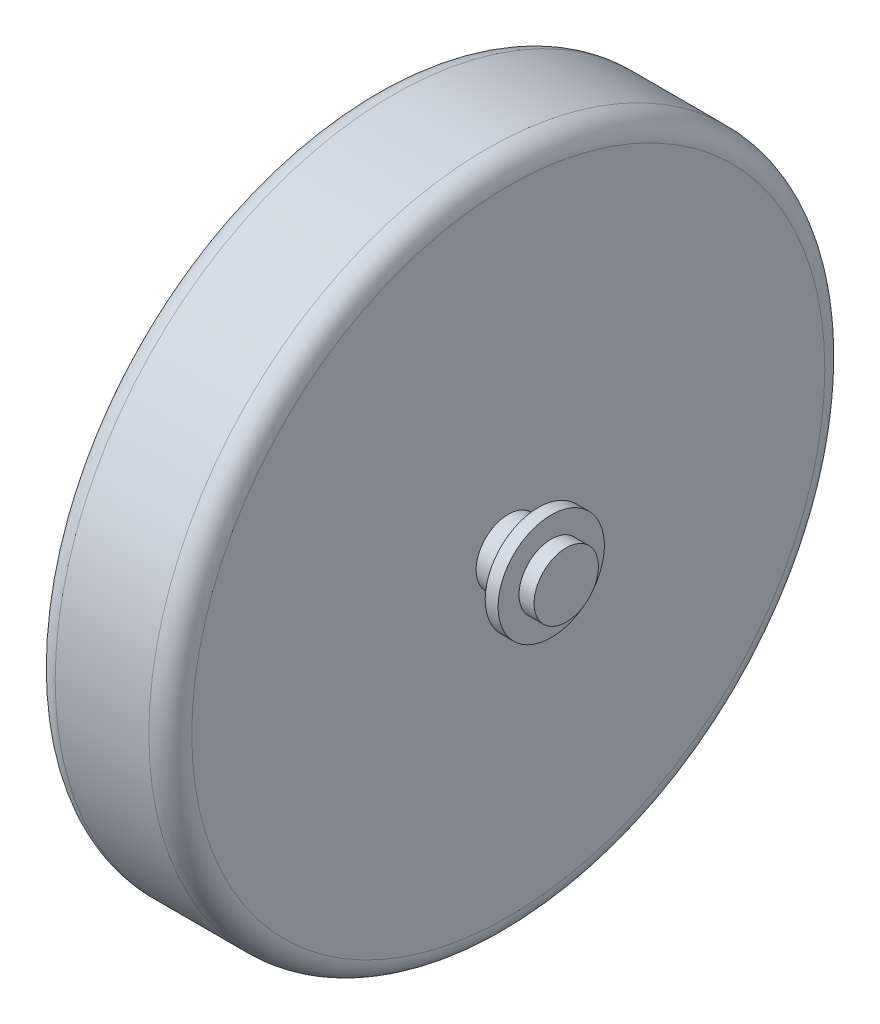
ISO-10303-21;
HEADER;
FILE_DESCRIPTION(('STEP AP214'),'2;1');
FILE_NAME('part.step','',(''),(''),'','','');
FILE_SCHEMA(('AUTOMOTIVE_DESIGN { 1 0 10303 214 1 1 1 1 }'));
ENDSEC;
DATA;
#1=APPLICATION_CONTEXT('core data for automotive mechanical design processes');
#2=APPLICATION_PROTOCOL_DEFINITION('international standard','automotive_design',2000,#1);
#3=PRODUCT_CONTEXT('',#1,'mechanical');
#4=PRODUCT('Part','Part','',(#3));
#5=PRODUCT_RELATED_PRODUCT_CATEGORY('part','',(#4));
#6=PRODUCT_DEFINITION_FORMATION('','',#4);
#7=PRODUCT_DEFINITION_CONTEXT('part definition',#1,'design');
#8=PRODUCT_DEFINITION('design','',#6,#7);
#9=PRODUCT_DEFINITION_SHAPE('','',#8);
#10=(LENGTH_UNIT() NAMED_UNIT(*) SI_UNIT(.MILLI.,.METRE.));
#11=(NAMED_UNIT(*) PLANE_ANGLE_UNIT() SI_UNIT($,.RADIAN.));
#12=(NAMED_UNIT(*) SI_UNIT($,.STERADIAN.) SOLID_ANGLE_UNIT());
#13=UNCERTAINTY_MEASURE_WITH_UNIT(LENGTH_MEASURE(1.E-05),#10,'distance_accuracy_value','');
#14=(GEOMETRIC_REPRESENTATION_CONTEXT(3) GLOBAL_UNCERTAINTY_ASSIGNED_CONTEXT((#13)) GLOBAL_UNIT_ASSIGNED_CONTEXT((#10,
#11,#12)) REPRESENTATION_CONTEXT('',''));
#15=CARTESIAN_POINT('',(0.,0.,0.));
#16=DIRECTION('',(0.,0.,1.));
#17=DIRECTION('',(1.,0.,0.));
#18=AXIS2_PLACEMENT_3D('',#15,#16,#17);
#19=CARTESIAN_POINT('',(-119.,0.,0.));
#20=DIRECTION('',(-1.,0.,0.));
#21=DIRECTION('',(0.,0.,1.));
#22=AXIS2_PLACEMENT_3D('',#19,#20,#21);
#23=CYLINDRICAL_SURFACE('',#22,63.5);
#24=CARTESIAN_POINT('',(-97.,0.,0.));
#25=DIRECTION('',(-1.,0.,0.));
#26=DIRECTION('',(0.,0.,1.));
#27=AXIS2_PLACEMENT_3D('',#24,#25,#26);
#28=CIRCLE('',#27,63.5);
#29=CARTESIAN_POINT('',(-97.,0.,63.5));
#30=VERTEX_POINT('',#29);
#31=EDGE_CURVE('E56',#30,#30,#28,.T.);
#32=ORIENTED_EDGE('',*,*,#31,.F.);
#33=EDGE_LOOP('',(#32));
#34=FACE_BOUND('',#33,.T.);
#35=CARTESIAN_POINT('',(-90.65,0.,0.));
#36=DIRECTION('',(-1.,0.,0.));
#37=DIRECTION('',(0.,0.,1.));
#38=AXIS2_PLACEMENT_3D('',#35,#36,#37);
#39=CIRCLE('',#38,63.5);
#40=CARTESIAN_POINT('',(-90.65,0.,63.5));
#41=VERTEX_POINT('',#40);
#42=EDGE_CURVE('E88',#41,#41,#39,.T.);
#43=ORIENTED_EDGE('',*,*,#42,.T.);
#44=EDGE_LOOP('',(#43));
#45=FACE_BOUND('',#44,.T.);
#46=ADVANCED_FACE('F39',(#34,#45),#23,.T.);
#47=CARTESIAN_POINT('',(-97.,0.,-63.5));
#48=DIRECTION('',(1.,0.,0.));
#49=DIRECTION('',(0.,0.,-1.));
#50=AXIS2_PLACEMENT_3D('',#47,#48,#49);
#51=PLANE('',#50);
#52=CARTESIAN_POINT('',(-97.,58.,0.));
#53=DIRECTION('',(-1.,0.,0.));
#54=DIRECTION('',(0.,0.,1.));
#55=AXIS2_PLACEMENT_3D('',#52,#53,#54);
#56=CIRCLE('',#55,3.175);
#57=CARTESIAN_POINT('',(-97.,58.,3.17500000000001));
#58=VERTEX_POINT('',#57);
#59=EDGE_CURVE('E113',#58,#58,#56,.T.);
#60=ORIENTED_EDGE('',*,*,#59,.F.);
#61=EDGE_LOOP('',(#60));
#62=FACE_BOUND('',#61,.T.);
#63=CARTESIAN_POINT('',(-97.,29.0000000000077,-50.229473419493));
#64=DIRECTION('',(-1.,0.,0.));
#65=DIRECTION('',(0.,0.,1.));
#66=AXIS2_PLACEMENT_3D('',#63,#64,#65);
#67=CIRCLE('',#66,3.17499999999217);
#68=CARTESIAN_POINT('',(-97.,29.0000000000077,-47.0544734195008));
#69=VERTEX_POINT('',#68);
#70=EDGE_CURVE('E94',#69,#69,#67,.T.);
#71=ORIENTED_EDGE('',*,*,#70,.F.);
#72=EDGE_LOOP('',(#71));
#73=FACE_BOUND('',#72,.T.);
#74=CARTESIAN_POINT('',(-97.,-28.9999999999939,-50.229473419501));
#75=DIRECTION('',(-1.,0.,0.));
#76=DIRECTION('',(0.,0.,1.));
#77=AXIS2_PLACEMENT_3D('',#74,#75,#76);
#78=CIRCLE('',#77,3.17499999999374);
#79=CARTESIAN_POINT('',(-97.,-28.9999999999939,-47.0544734195072));
#80=VERTEX_POINT('',#79);
#81=EDGE_CURVE('E91',#80,#80,#78,.T.);
#82=ORIENTED_EDGE('',*,*,#81,.F.);
#83=EDGE_LOOP('',(#82));
#84=FACE_BOUND('',#83,.T.);
#85=CARTESIAN_POINT('',(-97.,-58.,-5.28919774014336E-12));
#86=DIRECTION('',(-1.,0.,0.));
#87=DIRECTION('',(0.,0.,1.));
#88=AXIS2_PLACEMENT_3D('',#85,#86,#87);
#89=CIRCLE('',#88,3.17499999999532);
#90=CARTESIAN_POINT('',(-97.,-58.,3.17499999999003));
#91=VERTEX_POINT('',#90);
#92=EDGE_CURVE('E99',#91,#91,#89,.T.);
#93=ORIENTED_EDGE('',*,*,#92,.F.);
#94=EDGE_LOOP('',(#93));
#95=FACE_BOUND('',#94,.T.);
#96=CARTESIAN_POINT('',(-97.,-29.0000000000031,50.2294734194957));
#97=DIRECTION('',(-1.,0.,0.));
#98=DIRECTION('',(0.,0.,1.));
#99=AXIS2_PLACEMENT_3D('',#96,#97,#98);
#100=CIRCLE('',#99,3.17499999999688);
#101=CARTESIAN_POINT('',(-97.,-29.0000000000031,53.4044734194926));
#102=VERTEX_POINT('',#101);
#103=EDGE_CURVE('E106',#102,#102,#100,.T.);
#104=ORIENTED_EDGE('',*,*,#103,.F.);
#105=EDGE_LOOP('',(#104));
#106=FACE_BOUND('',#105,.T.);
#107=CARTESIAN_POINT('',(-97.,28.9999999999985,50.2294734194983));
#108=DIRECTION('',(-1.,0.,0.));
#109=DIRECTION('',(0.,0.,1.));
#110=AXIS2_PLACEMENT_3D('',#107,#108,#109);
#111=CIRCLE('',#110,3.17499999999843);
#112=CARTESIAN_POINT('',(-97.,28.9999999999985,53.4044734194968));
#113=VERTEX_POINT('',#112);
#114=EDGE_CURVE('E115',#113,#113,#111,.T.);
#115=ORIENTED_EDGE('',*,*,#114,.F.);
#116=EDGE_LOOP('',(#115));
#117=FACE_BOUND('',#116,.T.);
#118=CARTESIAN_POINT('',(-97.,0.,0.));
#119=DIRECTION('',(-1.,0.,0.));
#120=DIRECTION('',(0.,0.,1.));
#121=AXIS2_PLACEMENT_3D('',#118,#119,#120);
#122=CIRCLE('',#121,47.);
#123=CARTESIAN_POINT('',(-97.,0.,47.));
#124=VERTEX_POINT('',#123);
#125=EDGE_CURVE('E65',#124,#124,#122,.T.);
#126=ORIENTED_EDGE('',*,*,#125,.F.);
#127=EDGE_LOOP('',(#126));
#128=FACE_BOUND('',#127,.T.);
#129=ORIENTED_EDGE('',*,*,#31,.T.);
#130=EDGE_LOOP('',(#129));
#131=FACE_BOUND('',#130,.T.);
#132=ADVANCED_FACE('F134',(#62,#73,#84,#95,#106,#117,#128,#131),#51,.F.);
#133=CARTESIAN_POINT('',(-119.,0.,0.));
#134=DIRECTION('',(-1.,0.,0.));
#135=DIRECTION('',(0.,0.,1.));
#136=AXIS2_PLACEMENT_3D('',#133,#134,#135);
#137=CYLINDRICAL_SURFACE('',#136,47.);
#138=CARTESIAN_POINT('',(-119.,0.,0.));
#139=DIRECTION('',(-1.,0.,0.));
#140=DIRECTION('',(0.,0.,1.));
#141=AXIS2_PLACEMENT_3D('',#138,#139,#140);
#142=CIRCLE('',#141,47.);
#143=CARTESIAN_POINT('',(-119.,0.,47.));
#144=VERTEX_POINT('',#143);
#145=EDGE_CURVE('E64',#144,#144,#142,.T.);
#146=ORIENTED_EDGE('',*,*,#145,.F.);
#147=EDGE_LOOP('',(#146));
#148=FACE_BOUND('',#147,.T.);
#149=ORIENTED_EDGE('',*,*,#125,.T.);
#150=EDGE_LOOP('',(#149));
#151=FACE_BOUND('',#150,.T.);
#152=ADVANCED_FACE('F139',(#148,#151),#137,.T.);
#153=CARTESIAN_POINT('',(-119.,0.,-47.));
#154=DIRECTION('',(1.,0.,0.));
#155=DIRECTION('',(0.,0.,-1.));
#156=AXIS2_PLACEMENT_3D('',#153,#154,#155);
#157=PLANE('',#156);
#158=ORIENTED_EDGE('',*,*,#145,.T.);
#159=EDGE_LOOP('',(#158));
#160=FACE_BOUND('',#159,.T.);
#161=ADVANCED_FACE('F203',(#160),#157,.F.);
#162=CARTESIAN_POINT('',(0.,0.,-15.));
#163=DIRECTION('',(-1.,0.,0.));
#164=DIRECTION('',(0.,0.,1.));
#165=AXIS2_PLACEMENT_3D('',#162,#163,#164);
#166=PLANE('',#165);
#167=CARTESIAN_POINT('',(0.,0.,0.));
#168=DIRECTION('',(-1.,0.,0.));
#169=DIRECTION('',(0.,0.,1.));
#170=AXIS2_PLACEMENT_3D('',#167,#168,#169);
#171=CIRCLE('',#170,15.);
#172=CARTESIAN_POINT('',(0.,0.,15.));
#173=VERTEX_POINT('',#172);
#174=EDGE_CURVE('E69',#173,#173,#171,.T.);
#175=ORIENTED_EDGE('',*,*,#174,.F.);
#176=EDGE_LOOP('',(#175));
#177=FACE_BOUND('',#176,.T.);
#178=ADVANCED_FACE('F197',(#177),#166,.F.);
#179=CARTESIAN_POINT('',(-119.,0.,0.));
#180=DIRECTION('',(-1.,0.,0.));
#181=DIRECTION('',(0.,0.,1.));
#182=AXIS2_PLACEMENT_3D('',#179,#180,#181);
#183=CYLINDRICAL_SURFACE('',#182,15.);
#184=CARTESIAN_POINT('',(-7.00000000000001,0.,0.));
#185=DIRECTION('',(-1.,0.,0.));
#186=DIRECTION('',(0.,0.,1.));
#187=AXIS2_PLACEMENT_3D('',#184,#185,#186);
#188=CIRCLE('',#187,15.);
#189=CARTESIAN_POINT('',(-7.,0.,15.));
#190=VERTEX_POINT('',#189);
#191=EDGE_CURVE('E72',#190,#190,#188,.T.);
#192=ORIENTED_EDGE('',*,*,#191,.F.);
#193=EDGE_LOOP('',(#192));
#194=FACE_BOUND('',#193,.T.);
#195=ORIENTED_EDGE('',*,*,#174,.T.);
#196=EDGE_LOOP('',(#195));
#197=FACE_BOUND('',#196,.T.);
#198=ADVANCED_FACE('F194',(#194,#197),#183,.T.);
#199=CARTESIAN_POINT('',(-7.,0.,-24.7657490065609));
#200=DIRECTION('',(-1.,0.,0.));
#201=DIRECTION('',(0.,0.,1.));
#202=AXIS2_PLACEMENT_3D('',#199,#200,#201);
#203=PLANE('',#202);
#204=CARTESIAN_POINT('',(-7.00000000000001,0.,0.));
#205=DIRECTION('',(-1.,0.,0.));
#206=DIRECTION('',(0.,0.,1.));
#207=AXIS2_PLACEMENT_3D('',#204,#205,#206);
#208=CIRCLE('',#207,24.7657490065609);
#209=CARTESIAN_POINT('',(-7.,0.,24.7657490065609));
#210=VERTEX_POINT('',#209);
#211=EDGE_CURVE('E74',#210,#210,#208,.T.);
#212=ORIENTED_EDGE('',*,*,#211,.F.);
#213=EDGE_LOOP('',(#212));
#214=FACE_BOUND('',#213,.T.);
#215=ORIENTED_EDGE('',*,*,#191,.T.);
#216=EDGE_LOOP('',(#215));
#217=FACE_BOUND('',#216,.T.);
#218=ADVANCED_FACE('F188',(#214,#217),#203,.F.);
#219=CARTESIAN_POINT('',(-119.,0.,0.));
#220=DIRECTION('',(-1.,0.,0.));
#221=DIRECTION('',(0.,0.,1.));
#222=AXIS2_PLACEMENT_3D('',#219,#220,#221);
#223=CYLINDRICAL_SURFACE('',#222,24.7657490065609);
#224=CARTESIAN_POINT('',(-13.,0.,0.));
#225=DIRECTION('',(-1.,0.,0.));
#226=DIRECTION('',(0.,0.,1.));
#227=AXIS2_PLACEMENT_3D('',#224,#225,#226);
#228=CIRCLE('',#227,24.7657490065609);
#229=CARTESIAN_POINT('',(-13.,0.,24.7657490065609));
#230=VERTEX_POINT('',#229);
#231=EDGE_CURVE('E80',#230,#230,#228,.T.);
#232=ORIENTED_EDGE('',*,*,#231,.F.);
#233=EDGE_LOOP('',(#232));
#234=FACE_BOUND('',#233,.T.);
#235=ORIENTED_EDGE('',*,*,#211,.T.);
#236=EDGE_LOOP('',(#235));
#237=FACE_BOUND('',#236,.T.);
#238=ADVANCED_FACE('F183',(#234,#237),#223,.T.);
#239=CARTESIAN_POINT('',(-13.,0.,-15.));
#240=DIRECTION('',(1.,0.,0.));
#241=DIRECTION('',(0.,0.,-1.));
#242=AXIS2_PLACEMENT_3D('',#239,#240,#241);
#243=PLANE('',#242);
#244=CARTESIAN_POINT('',(-13.,0.,0.));
#245=DIRECTION('',(-1.,0.,0.));
#246=DIRECTION('',(0.,0.,1.));
#247=AXIS2_PLACEMENT_3D('',#244,#245,#246);
#248=CIRCLE('',#247,15.);
#249=CARTESIAN_POINT('',(-13.,0.,15.));
#250=VERTEX_POINT('',#249);
#251=EDGE_CURVE('E79',#250,#250,#248,.T.);
#252=ORIENTED_EDGE('',*,*,#251,.F.);
#253=EDGE_LOOP('',(#252));
#254=FACE_BOUND('',#253,.T.);
#255=ORIENTED_EDGE('',*,*,#231,.T.);
#256=EDGE_LOOP('',(#255));
#257=FACE_BOUND('',#256,.T.);
#258=ADVANCED_FACE('F182',(#254,#257),#243,.F.);
#259=CARTESIAN_POINT('',(-119.,0.,0.));
#260=DIRECTION('',(-1.,0.,0.));
#261=DIRECTION('',(0.,0.,1.));
#262=AXIS2_PLACEMENT_3D('',#259,#260,#261);
#263=CYLINDRICAL_SURFACE('',#262,15.);
#264=CARTESIAN_POINT('',(-27.,0.,0.));
#265=DIRECTION('',(-1.,0.,0.));
#266=DIRECTION('',(0.,0.,1.));
#267=AXIS2_PLACEMENT_3D('',#264,#265,#266);
#268=CIRCLE('',#267,15.);
#269=CARTESIAN_POINT('',(-27.,0.,15.));
#270=VERTEX_POINT('',#269);
#271=EDGE_CURVE('E84',#270,#270,#268,.T.);
#272=ORIENTED_EDGE('',*,*,#271,.F.);
#273=EDGE_LOOP('',(#272));
#274=FACE_BOUND('',#273,.T.);
#275=ORIENTED_EDGE('',*,*,#251,.T.);
#276=EDGE_LOOP('',(#275));
#277=FACE_BOUND('',#276,.T.);
#278=ADVANCED_FACE('F179',(#274,#277),#263,.T.);
#279=CARTESIAN_POINT('',(-27.,0.,-157.5));
#280=DIRECTION('',(-1.,0.,0.));
#281=DIRECTION('',(0.,0.,1.));
#282=AXIS2_PLACEMENT_3D('',#279,#280,#281);
#283=PLANE('',#282);
#284=CARTESIAN_POINT('',(-27.,0.,0.));
#285=DIRECTION('',(-1.,0.,0.));
#286=DIRECTION('',(0.,0.,1.));
#287=AXIS2_PLACEMENT_3D('',#284,#285,#286);
#288=CIRCLE('',#287,147.5);
#289=CARTESIAN_POINT('',(-27.,0.,147.5));
#290=VERTEX_POINT('',#289);
#291=EDGE_CURVE('E46',#290,#290,#288,.F.);
#292=ORIENTED_EDGE('',*,*,#291,.T.);
#293=EDGE_LOOP('',(#292));
#294=FACE_BOUND('',#293,.T.);
#295=ORIENTED_EDGE('',*,*,#271,.T.);
#296=EDGE_LOOP('',(#295));
#297=FACE_BOUND('',#296,.T.);
#298=ADVANCED_FACE('F166',(#294,#297),#283,.F.);
#299=CARTESIAN_POINT('',(-119.,0.,0.));
#300=DIRECTION('',(-1.,0.,0.));
#301=DIRECTION('',(0.,0.,1.));
#302=AXIS2_PLACEMENT_3D('',#299,#300,#301);
#303=CYLINDRICAL_SURFACE('',#302,157.5);
#304=CARTESIAN_POINT('',(-37.,0.,0.));
#305=DIRECTION('',(-1.,0.,0.));
#306=DIRECTION('',(0.,0.,1.));
#307=AXIS2_PLACEMENT_3D('',#304,#305,#306);
#308=CIRCLE('',#307,157.5);
#309=CARTESIAN_POINT('',(-37.,0.,157.5));
#310=VERTEX_POINT('',#309);
#311=EDGE_CURVE('E49',#310,#310,#308,.T.);
#312=ORIENTED_EDGE('',*,*,#311,.T.);
#313=EDGE_LOOP('',(#312));
#314=FACE_BOUND('',#313,.T.);
#315=CARTESIAN_POINT('',(-80.65,0.,0.));
#316=DIRECTION('',(1.,0.,0.));
#317=DIRECTION('',(0.,0.,-1.));
#318=AXIS2_PLACEMENT_3D('',#315,#316,#317);
#319=CIRCLE('',#318,157.5);
#320=CARTESIAN_POINT('',(-80.65,0.,-157.5));
#321=VERTEX_POINT('',#320);
#322=EDGE_CURVE('E53',#321,#321,#319,.T.);
#323=ORIENTED_EDGE('',*,*,#322,.T.);
#324=EDGE_LOOP('',(#323));
#325=FACE_BOUND('',#324,.T.);
#326=ADVANCED_FACE('F165',(#314,#325),#303,.T.);
#327=CARTESIAN_POINT('',(-90.65,0.,-63.5));
#328=DIRECTION('',(1.,0.,0.));
#329=DIRECTION('',(0.,0.,-1.));
#330=AXIS2_PLACEMENT_3D('',#327,#328,#329);
#331=PLANE('',#330);
#332=CARTESIAN_POINT('',(-90.65,0.,0.));
#333=DIRECTION('',(1.,0.,0.));
#334=DIRECTION('',(0.,0.,-1.));
#335=AXIS2_PLACEMENT_3D('',#332,#333,#334);
#336=CIRCLE('',#335,147.5);
#337=CARTESIAN_POINT('',(-90.65,0.,-147.5));
#338=VERTEX_POINT('',#337);
#339=EDGE_CURVE('E10',#338,#338,#336,.F.);
#340=ORIENTED_EDGE('',*,*,#339,.T.);
#341=EDGE_LOOP('',(#340));
#342=FACE_BOUND('',#341,.T.);
#343=ORIENTED_EDGE('',*,*,#42,.F.);
#344=EDGE_LOOP('',(#343));
#345=FACE_BOUND('',#344,.T.);
#346=ADVANCED_FACE('F157',(#342,#345),#331,.F.);
#347=CARTESIAN_POINT('',(-37.,0.,0.));
#348=DIRECTION('',(-1.,0.,0.));
#349=DIRECTION('',(0.,0.,1.));
#350=AXIS2_PLACEMENT_3D('',#347,#348,#349);
#351=TOROIDAL_SURFACE('',#350,147.5,10.);
#352=ORIENTED_EDGE('',*,*,#291,.F.);
#353=EDGE_LOOP('',(#352));
#354=FACE_BOUND('',#353,.T.);
#355=ORIENTED_EDGE('',*,*,#311,.F.);
#356=EDGE_LOOP('',(#355));
#357=FACE_BOUND('',#356,.T.);
#358=ADVANCED_FACE('F161',(#354,#357),#351,.T.);
#359=CARTESIAN_POINT('',(-80.65,0.,0.));
#360=DIRECTION('',(1.,0.,0.));
#361=DIRECTION('',(0.,0.,-1.));
#362=AXIS2_PLACEMENT_3D('',#359,#360,#361);
#363=TOROIDAL_SURFACE('',#362,147.5,10.);
#364=ORIENTED_EDGE('',*,*,#322,.F.);
#365=EDGE_LOOP('',(#364));
#366=FACE_BOUND('',#365,.T.);
#367=ORIENTED_EDGE('',*,*,#339,.F.);
#368=EDGE_LOOP('',(#367));
#369=FACE_BOUND('',#368,.T.);
#370=ADVANCED_FACE('F41',(#366,#369),#363,.T.);
#371=CARTESIAN_POINT('',(-87.,28.9999999999985,50.2294734194983));
#372=DIRECTION('',(-1.,0.,0.));
#373=DIRECTION('',(0.,0.,1.));
#374=AXIS2_PLACEMENT_3D('',#371,#372,#373);
#375=CYLINDRICAL_SURFACE('',#374,3.17499999999843);
#376=CARTESIAN_POINT('',(-87.,28.9999999999985,50.2294734194983));
#377=DIRECTION('',(-1.,0.,0.));
#378=DIRECTION('',(0.,0.,1.));
#379=AXIS2_PLACEMENT_3D('',#376,#377,#378);
#380=CIRCLE('',#379,3.17499999999843);
#381=CARTESIAN_POINT('',(-87.,28.9999999999985,53.4044734194968));
#382=VERTEX_POINT('',#381);
#383=EDGE_CURVE('E108',#382,#382,#380,.T.);
#384=ORIENTED_EDGE('',*,*,#383,.F.);
#385=EDGE_LOOP('',(#384));
#386=FACE_BOUND('',#385,.T.);
#387=ORIENTED_EDGE('',*,*,#114,.T.);
#388=EDGE_LOOP('',(#387));
#389=FACE_BOUND('',#388,.T.);
#390=ADVANCED_FACE('F278',(#386,#389),#375,.F.);
#391=CARTESIAN_POINT('',(-87.,28.9999999999985,50.2294734194983));
#392=DIRECTION('',(-1.,0.,0.));
#393=DIRECTION('',(0.,0.,1.));
#394=AXIS2_PLACEMENT_3D('',#391,#392,#393);
#395=PLANE('',#394);
#396=ORIENTED_EDGE('',*,*,#383,.T.);
#397=EDGE_LOOP('',(#396));
#398=FACE_BOUND('',#397,.T.);
#399=ADVANCED_FACE('F286',(#398),#395,.T.);
#400=CARTESIAN_POINT('',(-87.,-29.0000000000031,50.2294734194957));
#401=DIRECTION('',(-1.,0.,0.));
#402=DIRECTION('',(0.,0.,1.));
#403=AXIS2_PLACEMENT_3D('',#400,#401,#402);
#404=CYLINDRICAL_SURFACE('',#403,3.17499999999688);
#405=CARTESIAN_POINT('',(-87.,-29.0000000000031,50.2294734194957));
#406=DIRECTION('',(-1.,0.,0.));
#407=DIRECTION('',(0.,0.,1.));
#408=AXIS2_PLACEMENT_3D('',#405,#406,#407);
#409=CIRCLE('',#408,3.17499999999688);
#410=CARTESIAN_POINT('',(-87.,-29.0000000000031,53.4044734194926));
#411=VERTEX_POINT('',#410);
#412=EDGE_CURVE('E103',#411,#411,#409,.T.);
#413=ORIENTED_EDGE('',*,*,#412,.F.);
#414=EDGE_LOOP('',(#413));
#415=FACE_BOUND('',#414,.T.);
#416=ORIENTED_EDGE('',*,*,#103,.T.);
#417=EDGE_LOOP('',(#416));
#418=FACE_BOUND('',#417,.T.);
#419=ADVANCED_FACE('F298',(#415,#418),#404,.F.);
#420=CARTESIAN_POINT('',(-87.,-29.0000000000031,50.2294734194957));
#421=DIRECTION('',(-1.,0.,0.));
#422=DIRECTION('',(0.,0.,1.));
#423=AXIS2_PLACEMENT_3D('',#420,#421,#422);
#424=PLANE('',#423);
#425=ORIENTED_EDGE('',*,*,#412,.T.);
#426=EDGE_LOOP('',(#425));
#427=FACE_BOUND('',#426,.T.);
#428=ADVANCED_FACE('F310',(#427),#424,.T.);
#429=CARTESIAN_POINT('',(-87.,-58.,-5.2901953883609E-12));
#430=DIRECTION('',(-1.,0.,0.));
#431=DIRECTION('',(0.,0.,1.));
#432=AXIS2_PLACEMENT_3D('',#429,#430,#431);
#433=CYLINDRICAL_SURFACE('',#432,3.17499999999532);
#434=CARTESIAN_POINT('',(-87.,-58.,-5.2901953883609E-12));
#435=DIRECTION('',(-1.,0.,0.));
#436=DIRECTION('',(0.,0.,1.));
#437=AXIS2_PLACEMENT_3D('',#434,#435,#436);
#438=CIRCLE('',#437,3.17499999999532);
#439=CARTESIAN_POINT('',(-87.,-58.,3.17499999999003));
#440=VERTEX_POINT('',#439);
#441=EDGE_CURVE('E100',#440,#440,#438,.T.);
#442=ORIENTED_EDGE('',*,*,#441,.F.);
#443=EDGE_LOOP('',(#442));
#444=FACE_BOUND('',#443,.T.);
#445=ORIENTED_EDGE('',*,*,#92,.T.);
#446=EDGE_LOOP('',(#445));
#447=FACE_BOUND('',#446,.T.);
#448=ADVANCED_FACE('F317',(#444,#447),#433,.F.);
#449=CARTESIAN_POINT('',(-87.,-58.,-5.2901953883609E-12));
#450=DIRECTION('',(-1.,0.,0.));
#451=DIRECTION('',(0.,0.,1.));
#452=AXIS2_PLACEMENT_3D('',#449,#450,#451);
#453=PLANE('',#452);
#454=ORIENTED_EDGE('',*,*,#441,.T.);
#455=EDGE_LOOP('',(#454));
#456=FACE_BOUND('',#455,.T.);
#457=ADVANCED_FACE('F328',(#456),#453,.T.);
#458=CARTESIAN_POINT('',(-87.,-28.9999999999939,-50.229473419501));
#459=DIRECTION('',(-1.,0.,0.));
#460=DIRECTION('',(0.,0.,1.));
#461=AXIS2_PLACEMENT_3D('',#458,#459,#460);
#462=CYLINDRICAL_SURFACE('',#461,3.17499999999374);
#463=CARTESIAN_POINT('',(-87.,-28.9999999999939,-50.229473419501));
#464=DIRECTION('',(-1.,0.,0.));
#465=DIRECTION('',(0.,0.,1.));
#466=AXIS2_PLACEMENT_3D('',#463,#464,#465);
#467=CIRCLE('',#466,3.17499999999374);
#468=CARTESIAN_POINT('',(-87.,-28.9999999999939,-47.0544734195072));
#469=VERTEX_POINT('',#468);
#470=EDGE_CURVE('E89',#469,#469,#467,.T.);
#471=ORIENTED_EDGE('',*,*,#470,.F.);
#472=EDGE_LOOP('',(#471));
#473=FACE_BOUND('',#472,.T.);
#474=ORIENTED_EDGE('',*,*,#81,.T.);
#475=EDGE_LOOP('',(#474));
#476=FACE_BOUND('',#475,.T.);
#477=ADVANCED_FACE('F338',(#473,#476),#462,.F.);
#478=CARTESIAN_POINT('',(-87.,-28.9999999999939,-50.229473419501));
#479=DIRECTION('',(-1.,0.,0.));
#480=DIRECTION('',(0.,0.,1.));
#481=AXIS2_PLACEMENT_3D('',#478,#479,#480);
#482=PLANE('',#481);
#483=ORIENTED_EDGE('',*,*,#470,.T.);
#484=EDGE_LOOP('',(#483));
#485=FACE_BOUND('',#484,.T.);
#486=ADVANCED_FACE('F172',(#485),#482,.T.);
#487=CARTESIAN_POINT('',(-87.,29.0000000000077,-50.229473419493));
#488=DIRECTION('',(-1.,0.,0.));
#489=DIRECTION('',(0.,0.,1.));
#490=AXIS2_PLACEMENT_3D('',#487,#488,#489);
#491=CYLINDRICAL_SURFACE('',#490,3.17499999999217);
#492=CARTESIAN_POINT('',(-87.,29.0000000000077,-50.229473419493));
#493=DIRECTION('',(-1.,0.,0.));
#494=DIRECTION('',(0.,0.,1.));
#495=AXIS2_PLACEMENT_3D('',#492,#493,#494);
#496=CIRCLE('',#495,3.17499999999217);
#497=CARTESIAN_POINT('',(-87.,29.0000000000077,-47.0544734195008));
#498=VERTEX_POINT('',#497);
#499=EDGE_CURVE('E116',#498,#498,#496,.T.);
#500=ORIENTED_EDGE('',*,*,#499,.F.);
#501=EDGE_LOOP('',(#500));
#502=FACE_BOUND('',#501,.T.);
#503=ORIENTED_EDGE('',*,*,#70,.T.);
#504=EDGE_LOOP('',(#503));
#505=FACE_BOUND('',#504,.T.);
#506=ADVANCED_FACE('F360',(#502,#505),#491,.F.);
#507=CARTESIAN_POINT('',(-87.,29.0000000000077,-50.229473419493));
#508=DIRECTION('',(-1.,0.,0.));
#509=DIRECTION('',(0.,0.,1.));
#510=AXIS2_PLACEMENT_3D('',#507,#508,#509);
#511=PLANE('',#510);
#512=ORIENTED_EDGE('',*,*,#499,.T.);
#513=EDGE_LOOP('',(#512));
#514=FACE_BOUND('',#513,.T.);
#515=ADVANCED_FACE('F131',(#514),#511,.T.);
#516=CARTESIAN_POINT('',(-87.,58.,0.));
#517=DIRECTION('',(-1.,0.,0.));
#518=DIRECTION('',(0.,0.,1.));
#519=AXIS2_PLACEMENT_3D('',#516,#517,#518);
#520=CYLINDRICAL_SURFACE('',#519,3.175);
#521=CARTESIAN_POINT('',(-87.,58.,0.));
#522=DIRECTION('',(-1.,0.,0.));
#523=DIRECTION('',(0.,0.,1.));
#524=AXIS2_PLACEMENT_3D('',#521,#522,#523);
#525=CIRCLE('',#524,3.175);
#526=CARTESIAN_POINT('',(-87.,58.,3.17500000000001));
#527=VERTEX_POINT('',#526);
#528=EDGE_CURVE('E90',#527,#527,#525,.T.);
#529=ORIENTED_EDGE('',*,*,#528,.F.);
#530=EDGE_LOOP('',(#529));
#531=FACE_BOUND('',#530,.T.);
#532=ORIENTED_EDGE('',*,*,#59,.T.);
#533=EDGE_LOOP('',(#532));
#534=FACE_BOUND('',#533,.T.);
#535=ADVANCED_FACE('F126',(#531,#534),#520,.F.);
#536=CARTESIAN_POINT('',(-87.,58.,0.));
#537=DIRECTION('',(-1.,0.,0.));
#538=DIRECTION('',(0.,0.,1.));
#539=AXIS2_PLACEMENT_3D('',#536,#537,#538);
#540=PLANE('',#539);
#541=ORIENTED_EDGE('',*,*,#528,.T.);
#542=EDGE_LOOP('',(#541));
#543=FACE_BOUND('',#542,.T.);
#544=ADVANCED_FACE('F127',(#543),#540,.T.);
#545=CLOSED_SHELL('',(#46,#132,#152,#161,#178,#198,#218,#238,#258,#278,#298,#326,#346,#358,#370,
#390,#399,#419,#428,#448,#457,#477,#486,#506,#515,#535,#544));
#546=MANIFOLD_SOLID_BREP('B2',#545);
#547=ADVANCED_BREP_SHAPE_REPRESENTATION('',(#18,#546),#14);
#548=SHAPE_DEFINITION_REPRESENTATION(#9,#547);
ENDSEC;
END-ISO-10303-21;
